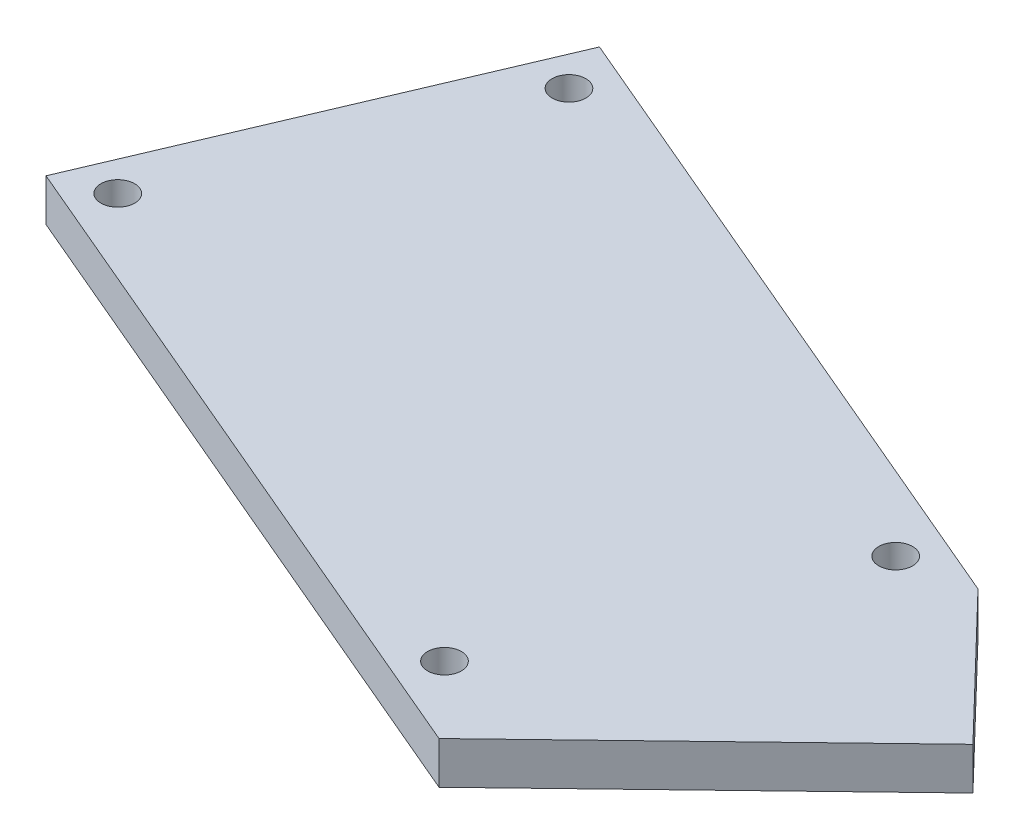
ISO-10303-21;
HEADER;
FILE_DESCRIPTION(('STEP AP214'),'2;1');
FILE_NAME('part.step','',(''),(''),'','','');
FILE_SCHEMA(('AUTOMOTIVE_DESIGN { 1 0 10303 214 1 1 1 1 }'));
ENDSEC;
DATA;
#1=APPLICATION_CONTEXT('core data for automotive mechanical design processes');
#2=APPLICATION_PROTOCOL_DEFINITION('international standard','automotive_design',2000,#1);
#3=PRODUCT_CONTEXT('',#1,'mechanical');
#4=PRODUCT('Part','Part','',(#3));
#5=PRODUCT_RELATED_PRODUCT_CATEGORY('part','',(#4));
#6=PRODUCT_DEFINITION_FORMATION('','',#4);
#7=PRODUCT_DEFINITION_CONTEXT('part definition',#1,'design');
#8=PRODUCT_DEFINITION('design','',#6,#7);
#9=PRODUCT_DEFINITION_SHAPE('','',#8);
#10=(LENGTH_UNIT() NAMED_UNIT(*) SI_UNIT(.MILLI.,.METRE.));
#11=(NAMED_UNIT(*) PLANE_ANGLE_UNIT() SI_UNIT($,.RADIAN.));
#12=(NAMED_UNIT(*) SI_UNIT($,.STERADIAN.) SOLID_ANGLE_UNIT());
#13=UNCERTAINTY_MEASURE_WITH_UNIT(LENGTH_MEASURE(1.E-05),#10,'distance_accuracy_value','');
#14=(GEOMETRIC_REPRESENTATION_CONTEXT(3) GLOBAL_UNCERTAINTY_ASSIGNED_CONTEXT((#13)) GLOBAL_UNIT_ASSIGNED_CONTEXT((#10,
#11,#12)) REPRESENTATION_CONTEXT('',''));
#15=CARTESIAN_POINT('',(0.,0.,0.));
#16=DIRECTION('',(0.,0.,1.));
#17=DIRECTION('',(1.,0.,0.));
#18=AXIS2_PLACEMENT_3D('',#15,#16,#17);
#19=CARTESIAN_POINT('',(-24.8518212384792,3.175,58.4348952350449));
#20=DIRECTION('',(0.,-1.,0.));
#21=DIRECTION('',(-0.720299371552158,0.,0.693663329967475));
#22=AXIS2_PLACEMENT_3D('',#19,#20,#21);
#23=PLANE('',#22);
#24=CARTESIAN_POINT('',(-19.5540493353952,3.175,29.373907568828));
#25=DIRECTION('',(0.,-1.,0.));
#26=DIRECTION('',(0.720299371552158,0.,-0.693663329967475));
#27=AXIS2_PLACEMENT_3D('',#24,#25,#26);
#28=CIRCLE('',#27,1.27);
#29=CARTESIAN_POINT('',(-18.639269133524,3.175,28.4929551397693));
#30=VERTEX_POINT('',#29);
#31=EDGE_CURVE('E144',#30,#30,#28,.T.);
#32=ORIENTED_EDGE('',*,*,#31,.T.);
#33=EDGE_LOOP('',(#32));
#34=FACE_BOUND('',#33,.T.);
#35=CARTESIAN_POINT('',(-72.4548965304406,3.175,35.0017554638543));
#36=DIRECTION('',(0.,-1.,0.));
#37=DIRECTION('',(0.720299371552158,0.,-0.693663329967475));
#38=AXIS2_PLACEMENT_3D('',#35,#36,#37);
#39=CIRCLE('',#38,1.27);
#40=CARTESIAN_POINT('',(-71.5401163285694,3.175,34.1208030347956));
#41=VERTEX_POINT('',#40);
#42=EDGE_CURVE('E117',#41,#41,#39,.T.);
#43=ORIENTED_EDGE('',*,*,#42,.T.);
#44=EDGE_LOOP('',(#43));
#45=FACE_BOUND('',#44,.T.);
#46=DIRECTION('',(-0.720299371552158,0.,0.693663329967475));
#47=VECTOR('',#46,1.);
#48=CARTESIAN_POINT('',(-24.8518212384792,3.175,58.4348952350449));
#49=LINE('',#48,#47);
#50=CARTESIAN_POINT('',(-4.38797903757287,3.175,38.7277880437377));
#51=VERTEX_POINT('',#50);
#52=CARTESIAN_POINT('',(-24.8518212384792,3.175,58.4348952350449));
#53=VERTEX_POINT('',#52);
#54=EDGE_CURVE('E126',#51,#53,#49,.T.);
#55=ORIENTED_EDGE('',*,*,#54,.F.);
#56=DIRECTION('',(0.693663329967475,0.,0.720299371552158));
#57=VECTOR('',#56,1.);
#58=CARTESIAN_POINT('',(-4.38797903757287,3.175,38.7277880437377));
#59=LINE('',#58,#57);
#60=CARTESIAN_POINT('',(-14.3240410529597,3.175,28.4101902752035));
#61=VERTEX_POINT('',#60);
#62=EDGE_CURVE('E108',#61,#51,#59,.T.);
#63=ORIENTED_EDGE('',*,*,#62,.F.);
#64=DIRECTION('',(0.920234570630629,0.,0.391367263598097));
#65=VECTOR('',#64,1.);
#66=CARTESIAN_POINT('',(-63.8768322122778,3.175,7.33584586497313));
#67=LINE('',#66,#65);
#68=CARTESIAN_POINT('',(-63.8768322122778,3.175,7.33584586497313));
#69=VERTEX_POINT('',#68);
#70=EDGE_CURVE('E92',#69,#61,#67,.T.);
#71=ORIENTED_EDGE('',*,*,#70,.F.);
#72=DIRECTION('',(0.391367263598097,0.,-0.920234570630629));
#73=VECTOR('',#72,1.);
#74=CARTESIAN_POINT('',(-76.3027428315174,3.175,36.5532934824956));
#75=LINE('',#74,#73);
#76=CARTESIAN_POINT('',(-76.3027428315174,3.175,36.5532934824956));
#77=VERTEX_POINT('',#76);
#78=EDGE_CURVE('E101',#77,#69,#75,.T.);
#79=ORIENTED_EDGE('',*,*,#78,.F.);
#80=DIRECTION('',(-0.920234570630629,0.,-0.391367263598097));
#81=VECTOR('',#80,1.);
#82=CARTESIAN_POINT('',(-24.8518212384792,3.175,58.4348952350449));
#83=LINE('',#82,#81);
#84=EDGE_CURVE('E104',#53,#77,#83,.T.);
#85=ORIENTED_EDGE('',*,*,#84,.F.);
#86=EDGE_LOOP('',(#55,#63,#71,#79,#85));
#87=FACE_BOUND('',#86,.T.);
#88=CARTESIAN_POINT('',(-62.3252941936365,3.175,11.18369216605));
#89=DIRECTION('',(0.,-1.,0.));
#90=DIRECTION('',(0.720299371552158,0.,-0.693663329967475));
#91=AXIS2_PLACEMENT_3D('',#88,#89,#90);
#92=CIRCLE('',#91,1.27);
#93=CARTESIAN_POINT('',(-61.4105139917652,3.175,10.3027397369913));
#94=VERTEX_POINT('',#93);
#95=EDGE_CURVE('E138',#94,#94,#92,.T.);
#96=ORIENTED_EDGE('',*,*,#95,.T.);
#97=EDGE_LOOP('',(#96));
#98=FACE_BOUND('',#97,.T.);
#99=CARTESIAN_POINT('',(-29.6836516721993,3.175,53.1919708666323));
#100=DIRECTION('',(0.,-1.,0.));
#101=DIRECTION('',(0.720299371552158,0.,-0.693663329967475));
#102=AXIS2_PLACEMENT_3D('',#99,#100,#101);
#103=CIRCLE('',#102,1.27);
#104=CARTESIAN_POINT('',(-28.7688714703281,3.175,52.3110184375736));
#105=VERTEX_POINT('',#104);
#106=EDGE_CURVE('E150',#105,#105,#103,.T.);
#107=ORIENTED_EDGE('',*,*,#106,.T.);
#108=EDGE_LOOP('',(#107));
#109=FACE_BOUND('',#108,.T.);
#110=ADVANCED_FACE('F37',(#34,#45,#87,#98,#109),#23,.F.);
#111=CARTESIAN_POINT('',(-24.8518212384792,0.,58.4348952350449));
#112=DIRECTION('',(0.,-1.,0.));
#113=DIRECTION('',(-0.720299371552158,0.,0.693663329967475));
#114=AXIS2_PLACEMENT_3D('',#111,#112,#113);
#115=PLANE('',#114);
#116=CARTESIAN_POINT('',(-19.5540493353952,0.,29.373907568828));
#117=DIRECTION('',(0.,-1.,0.));
#118=DIRECTION('',(0.720299371552158,0.,-0.693663329967475));
#119=AXIS2_PLACEMENT_3D('',#116,#117,#118);
#120=CIRCLE('',#119,1.27);
#121=CARTESIAN_POINT('',(-18.639269133524,0.,28.4929551397693));
#122=VERTEX_POINT('',#121);
#123=EDGE_CURVE('E147',#122,#122,#120,.T.);
#124=ORIENTED_EDGE('',*,*,#123,.F.);
#125=EDGE_LOOP('',(#124));
#126=FACE_BOUND('',#125,.T.);
#127=CARTESIAN_POINT('',(-72.4548965304406,0.,35.0017554638543));
#128=DIRECTION('',(0.,-1.,0.));
#129=DIRECTION('',(0.720299371552158,0.,-0.693663329967475));
#130=AXIS2_PLACEMENT_3D('',#127,#128,#129);
#131=CIRCLE('',#130,1.27);
#132=CARTESIAN_POINT('',(-71.5401163285694,0.,34.1208030347956));
#133=VERTEX_POINT('',#132);
#134=EDGE_CURVE('E135',#133,#133,#131,.T.);
#135=ORIENTED_EDGE('',*,*,#134,.F.);
#136=EDGE_LOOP('',(#135));
#137=FACE_BOUND('',#136,.T.);
#138=DIRECTION('',(-0.720299371552158,0.,0.693663329967475));
#139=VECTOR('',#138,1.);
#140=CARTESIAN_POINT('',(-24.8518212384792,0.,58.4348952350449));
#141=LINE('',#140,#139);
#142=CARTESIAN_POINT('',(-4.38797903757287,0.,38.7277880437377));
#143=VERTEX_POINT('',#142);
#144=CARTESIAN_POINT('',(-24.8518212384792,0.,58.4348952350449));
#145=VERTEX_POINT('',#144);
#146=EDGE_CURVE('E113',#143,#145,#141,.T.);
#147=ORIENTED_EDGE('',*,*,#146,.T.);
#148=DIRECTION('',(-0.920234570630629,0.,-0.391367263598097));
#149=VECTOR('',#148,1.);
#150=CARTESIAN_POINT('',(-24.8518212384792,0.,58.4348952350449));
#151=LINE('',#150,#149);
#152=CARTESIAN_POINT('',(-76.3027428315174,0.,36.5532934824956));
#153=VERTEX_POINT('',#152);
#154=EDGE_CURVE('E116',#145,#153,#151,.T.);
#155=ORIENTED_EDGE('',*,*,#154,.T.);
#156=DIRECTION('',(0.391367263598097,0.,-0.920234570630629));
#157=VECTOR('',#156,1.);
#158=CARTESIAN_POINT('',(-76.3027428315174,0.,36.5532934824956));
#159=LINE('',#158,#157);
#160=CARTESIAN_POINT('',(-63.8768322122778,0.,7.33584586497313));
#161=VERTEX_POINT('',#160);
#162=EDGE_CURVE('E120',#153,#161,#159,.T.);
#163=ORIENTED_EDGE('',*,*,#162,.T.);
#164=DIRECTION('',(0.920234570630629,0.,0.391367263598097));
#165=VECTOR('',#164,1.);
#166=CARTESIAN_POINT('',(-63.8768322122778,0.,7.33584586497313));
#167=LINE('',#166,#165);
#168=CARTESIAN_POINT('',(-14.3240410529597,0.,28.4101902752035));
#169=VERTEX_POINT('',#168);
#170=EDGE_CURVE('E95',#161,#169,#167,.T.);
#171=ORIENTED_EDGE('',*,*,#170,.T.);
#172=DIRECTION('',(0.693663329967475,0.,0.720299371552158));
#173=VECTOR('',#172,1.);
#174=CARTESIAN_POINT('',(-4.38797903757287,0.,38.7277880437377));
#175=LINE('',#174,#173);
#176=EDGE_CURVE('E123',#169,#143,#175,.T.);
#177=ORIENTED_EDGE('',*,*,#176,.T.);
#178=EDGE_LOOP('',(#147,#155,#163,#171,#177));
#179=FACE_BOUND('',#178,.T.);
#180=CARTESIAN_POINT('',(-62.3252941936365,0.,11.18369216605));
#181=DIRECTION('',(0.,-1.,0.));
#182=DIRECTION('',(0.720299371552158,0.,-0.693663329967475));
#183=AXIS2_PLACEMENT_3D('',#180,#181,#182);
#184=CIRCLE('',#183,1.27);
#185=CARTESIAN_POINT('',(-61.4105139917652,0.,10.3027397369913));
#186=VERTEX_POINT('',#185);
#187=EDGE_CURVE('E141',#186,#186,#184,.T.);
#188=ORIENTED_EDGE('',*,*,#187,.F.);
#189=EDGE_LOOP('',(#188));
#190=FACE_BOUND('',#189,.T.);
#191=CARTESIAN_POINT('',(-29.6836516721993,0.,53.1919708666323));
#192=DIRECTION('',(0.,-1.,0.));
#193=DIRECTION('',(0.720299371552158,0.,-0.693663329967475));
#194=AXIS2_PLACEMENT_3D('',#191,#192,#193);
#195=CIRCLE('',#194,1.27);
#196=CARTESIAN_POINT('',(-28.7688714703281,0.,52.3110184375736));
#197=VERTEX_POINT('',#196);
#198=EDGE_CURVE('E153',#197,#197,#195,.T.);
#199=ORIENTED_EDGE('',*,*,#198,.F.);
#200=EDGE_LOOP('',(#199));
#201=FACE_BOUND('',#200,.T.);
#202=ADVANCED_FACE('F131',(#126,#137,#179,#190,#201),#115,.T.);
#203=CARTESIAN_POINT('',(-24.8518212384792,3.175,58.4348952350449));
#204=DIRECTION('',(-0.693663329967475,0.,-0.720299371552159));
#205=DIRECTION('',(0.720299371552158,0.,-0.693663329967475));
#206=AXIS2_PLACEMENT_3D('',#203,#204,#205);
#207=PLANE('',#206);
#208=ORIENTED_EDGE('',*,*,#146,.F.);
#209=DIRECTION('',(0.,-1.,0.));
#210=VECTOR('',#209,1.);
#211=CARTESIAN_POINT('',(-4.38797903757287,3.175,38.7277880437377));
#212=LINE('',#211,#210);
#213=EDGE_CURVE('E54',#51,#143,#212,.T.);
#214=ORIENTED_EDGE('',*,*,#213,.F.);
#215=ORIENTED_EDGE('',*,*,#54,.T.);
#216=DIRECTION('',(0.,-1.,0.));
#217=VECTOR('',#216,1.);
#218=CARTESIAN_POINT('',(-24.8518212384792,3.175,58.4348952350449));
#219=LINE('',#218,#217);
#220=EDGE_CURVE('E11',#53,#145,#219,.T.);
#221=ORIENTED_EDGE('',*,*,#220,.T.);
#222=EDGE_LOOP('',(#208,#214,#215,#221));
#223=FACE_BOUND('',#222,.T.);
#224=ADVANCED_FACE('F39',(#223),#207,.F.);
#225=CARTESIAN_POINT('',(-24.8518212384792,3.175,58.4348952350449));
#226=DIRECTION('',(0.391367263598097,0.,-0.920234570630629));
#227=DIRECTION('',(0.920234570630629,0.,0.391367263598097));
#228=AXIS2_PLACEMENT_3D('',#225,#226,#227);
#229=PLANE('',#228);
#230=ORIENTED_EDGE('',*,*,#154,.F.);
#231=ORIENTED_EDGE('',*,*,#220,.F.);
#232=ORIENTED_EDGE('',*,*,#84,.T.);
#233=DIRECTION('',(0.,-1.,0.));
#234=VECTOR('',#233,1.);
#235=CARTESIAN_POINT('',(-76.3027428315174,3.175,36.5532934824956));
#236=LINE('',#235,#234);
#237=EDGE_CURVE('E46',#77,#153,#236,.T.);
#238=ORIENTED_EDGE('',*,*,#237,.T.);
#239=EDGE_LOOP('',(#230,#231,#232,#238));
#240=FACE_BOUND('',#239,.T.);
#241=ADVANCED_FACE('F129',(#240),#229,.F.);
#242=CARTESIAN_POINT('',(-76.3027428315174,3.175,36.5532934824956));
#243=DIRECTION('',(0.920234570630628,0.,0.391367263598098));
#244=DIRECTION('',(-0.391367263598097,0.,0.920234570630629));
#245=AXIS2_PLACEMENT_3D('',#242,#243,#244);
#246=PLANE('',#245);
#247=ORIENTED_EDGE('',*,*,#162,.F.);
#248=ORIENTED_EDGE('',*,*,#237,.F.);
#249=ORIENTED_EDGE('',*,*,#78,.T.);
#250=DIRECTION('',(0.,-1.,0.));
#251=VECTOR('',#250,1.);
#252=CARTESIAN_POINT('',(-63.8768322122778,3.175,7.33584586497313));
#253=LINE('',#252,#251);
#254=EDGE_CURVE('E88',#69,#161,#253,.T.);
#255=ORIENTED_EDGE('',*,*,#254,.T.);
#256=EDGE_LOOP('',(#247,#248,#249,#255));
#257=FACE_BOUND('',#256,.T.);
#258=ADVANCED_FACE('F102',(#257),#246,.F.);
#259=CARTESIAN_POINT('',(-63.8768322122778,3.175,7.33584586497313));
#260=DIRECTION('',(-0.391367263598097,0.,0.920234570630629));
#261=DIRECTION('',(-0.920234570630629,0.,-0.391367263598097));
#262=AXIS2_PLACEMENT_3D('',#259,#260,#261);
#263=PLANE('',#262);
#264=ORIENTED_EDGE('',*,*,#170,.F.);
#265=ORIENTED_EDGE('',*,*,#254,.F.);
#266=ORIENTED_EDGE('',*,*,#70,.T.);
#267=DIRECTION('',(0.,-1.,0.));
#268=VECTOR('',#267,1.);
#269=CARTESIAN_POINT('',(-14.3240410529597,3.175,28.4101902752035));
#270=LINE('',#269,#268);
#271=EDGE_CURVE('E73',#61,#169,#270,.T.);
#272=ORIENTED_EDGE('',*,*,#271,.T.);
#273=EDGE_LOOP('',(#264,#265,#266,#272));
#274=FACE_BOUND('',#273,.T.);
#275=ADVANCED_FACE('F90',(#274),#263,.F.);
#276=CARTESIAN_POINT('',(-4.38797903757287,3.175,38.7277880437377));
#277=DIRECTION('',(-0.720299371552158,0.,0.693663329967475));
#278=DIRECTION('',(-0.693663329967475,0.,-0.720299371552158));
#279=AXIS2_PLACEMENT_3D('',#276,#277,#278);
#280=PLANE('',#279);
#281=ORIENTED_EDGE('',*,*,#176,.F.);
#282=ORIENTED_EDGE('',*,*,#271,.F.);
#283=ORIENTED_EDGE('',*,*,#62,.T.);
#284=ORIENTED_EDGE('',*,*,#213,.T.);
#285=EDGE_LOOP('',(#281,#282,#283,#284));
#286=FACE_BOUND('',#285,.T.);
#287=ADVANCED_FACE('F180',(#286),#280,.F.);
#288=CARTESIAN_POINT('',(-72.4548965304406,3.175,35.0017554638543));
#289=DIRECTION('',(0.,-1.,0.));
#290=DIRECTION('',(-0.720299371552158,0.,0.693663329967475));
#291=AXIS2_PLACEMENT_3D('',#288,#289,#290);
#292=CYLINDRICAL_SURFACE('',#291,1.27);
#293=ORIENTED_EDGE('',*,*,#42,.F.);
#294=EDGE_LOOP('',(#293));
#295=FACE_BOUND('',#294,.T.);
#296=ORIENTED_EDGE('',*,*,#134,.T.);
#297=EDGE_LOOP('',(#296));
#298=FACE_BOUND('',#297,.T.);
#299=ADVANCED_FACE('F183',(#295,#298),#292,.F.);
#300=CARTESIAN_POINT('',(-62.3252941936365,3.175,11.18369216605));
#301=DIRECTION('',(0.,-1.,0.));
#302=DIRECTION('',(-0.720299371552158,0.,0.693663329967475));
#303=AXIS2_PLACEMENT_3D('',#300,#301,#302);
#304=CYLINDRICAL_SURFACE('',#303,1.27);
#305=ORIENTED_EDGE('',*,*,#95,.F.);
#306=EDGE_LOOP('',(#305));
#307=FACE_BOUND('',#306,.T.);
#308=ORIENTED_EDGE('',*,*,#187,.T.);
#309=EDGE_LOOP('',(#308));
#310=FACE_BOUND('',#309,.T.);
#311=ADVANCED_FACE('F210',(#307,#310),#304,.F.);
#312=CARTESIAN_POINT('',(-19.5540493353952,3.175,29.373907568828));
#313=DIRECTION('',(0.,-1.,0.));
#314=DIRECTION('',(-0.720299371552158,0.,0.693663329967475));
#315=AXIS2_PLACEMENT_3D('',#312,#313,#314);
#316=CYLINDRICAL_SURFACE('',#315,1.27);
#317=ORIENTED_EDGE('',*,*,#31,.F.);
#318=EDGE_LOOP('',(#317));
#319=FACE_BOUND('',#318,.T.);
#320=ORIENTED_EDGE('',*,*,#123,.T.);
#321=EDGE_LOOP('',(#320));
#322=FACE_BOUND('',#321,.T.);
#323=ADVANCED_FACE('F163',(#319,#322),#316,.F.);
#324=CARTESIAN_POINT('',(-29.6836516721993,3.175,53.1919708666323));
#325=DIRECTION('',(0.,-1.,0.));
#326=DIRECTION('',(-0.720299371552158,0.,0.693663329967475));
#327=AXIS2_PLACEMENT_3D('',#324,#325,#326);
#328=CYLINDRICAL_SURFACE('',#327,1.27);
#329=ORIENTED_EDGE('',*,*,#106,.F.);
#330=EDGE_LOOP('',(#329));
#331=FACE_BOUND('',#330,.T.);
#332=ORIENTED_EDGE('',*,*,#198,.T.);
#333=EDGE_LOOP('',(#332));
#334=FACE_BOUND('',#333,.T.);
#335=ADVANCED_FACE('F160',(#331,#334),#328,.F.);
#336=CLOSED_SHELL('',(#110,#202,#224,#241,#258,#275,#287,#299,#311,#323,#335));
#337=MANIFOLD_SOLID_BREP('B2',#336);
#338=ADVANCED_BREP_SHAPE_REPRESENTATION('',(#18,#337),#14);
#339=SHAPE_DEFINITION_REPRESENTATION(#9,#338);
ENDSEC;
END-ISO-10303-21;
